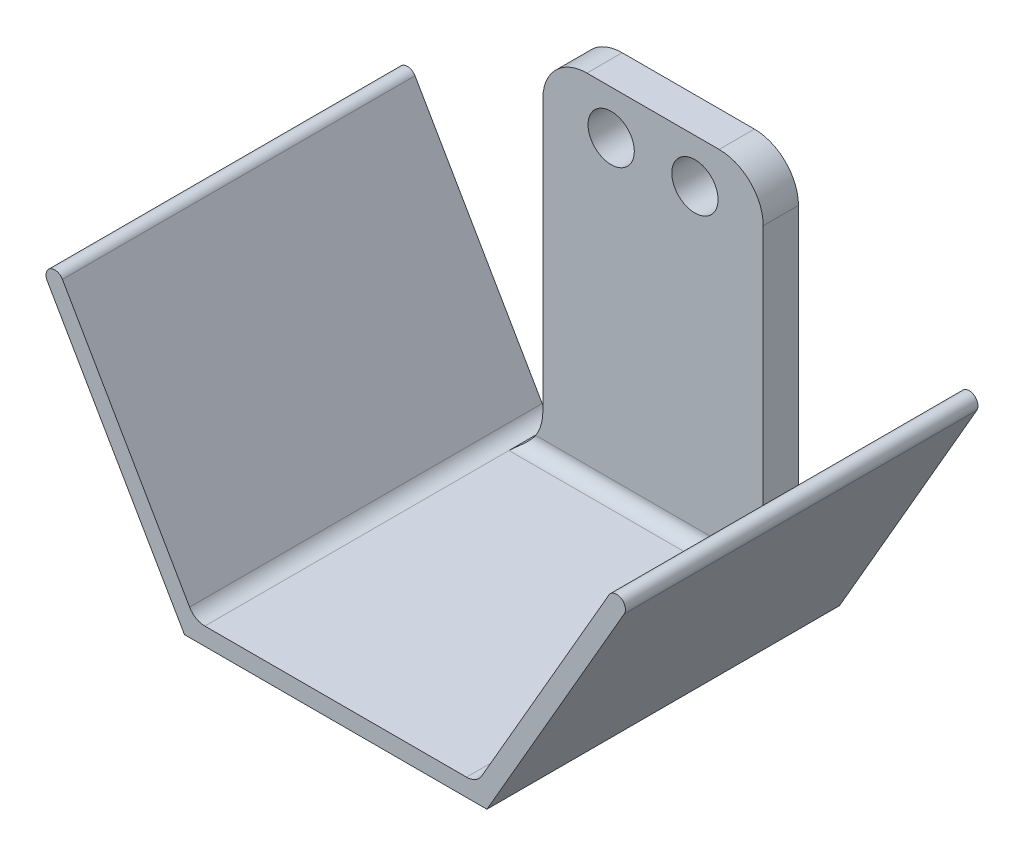
ISO-10303-21;
HEADER;
FILE_DESCRIPTION(('STEP AP214'),'2;1');
FILE_NAME('part.step','',(''),(''),'','','');
FILE_SCHEMA(('AUTOMOTIVE_DESIGN { 1 0 10303 214 1 1 1 1 }'));
ENDSEC;
DATA;
#1=APPLICATION_CONTEXT('core data for automotive mechanical design processes');
#2=APPLICATION_PROTOCOL_DEFINITION('international standard','automotive_design',2000,#1);
#3=PRODUCT_CONTEXT('',#1,'mechanical');
#4=PRODUCT('Part','Part','',(#3));
#5=PRODUCT_RELATED_PRODUCT_CATEGORY('part','',(#4));
#6=PRODUCT_DEFINITION_FORMATION('','',#4);
#7=PRODUCT_DEFINITION_CONTEXT('part definition',#1,'design');
#8=PRODUCT_DEFINITION('design','',#6,#7);
#9=PRODUCT_DEFINITION_SHAPE('','',#8);
#10=(LENGTH_UNIT() NAMED_UNIT(*) SI_UNIT(.MILLI.,.METRE.));
#11=(NAMED_UNIT(*) PLANE_ANGLE_UNIT() SI_UNIT($,.RADIAN.));
#12=(NAMED_UNIT(*) SI_UNIT($,.STERADIAN.) SOLID_ANGLE_UNIT());
#13=UNCERTAINTY_MEASURE_WITH_UNIT(LENGTH_MEASURE(1.E-05),#10,'distance_accuracy_value','');
#14=(GEOMETRIC_REPRESENTATION_CONTEXT(3) GLOBAL_UNCERTAINTY_ASSIGNED_CONTEXT((#13)) GLOBAL_UNIT_ASSIGNED_CONTEXT((#10,
#11,#12)) REPRESENTATION_CONTEXT('',''));
#15=CARTESIAN_POINT('',(0.,0.,0.));
#16=DIRECTION('',(0.,0.,1.));
#17=DIRECTION('',(1.,0.,0.));
#18=AXIS2_PLACEMENT_3D('',#15,#16,#17);
#19=CARTESIAN_POINT('',(-32.,0.,40.));
#20=DIRECTION('',(0.,-1.,0.));
#21=DIRECTION('',(1.,0.,0.));
#22=AXIS2_PLACEMENT_3D('',#19,#20,#21);
#23=PLANE('',#22);
#24=DIRECTION('',(0.,0.,-1.));
#25=VECTOR('',#24,1.);
#26=CARTESIAN_POINT('',(29.6905989232415,0.,-40.));
#27=LINE('',#26,#25);
#28=CARTESIAN_POINT('',(29.6905989232415,0.,40.));
#29=VERTEX_POINT('',#28);
#30=CARTESIAN_POINT('',(29.6905989232415,0.,-29.));
#31=VERTEX_POINT('',#30);
#32=EDGE_CURVE('E214',#29,#31,#27,.T.);
#33=ORIENTED_EDGE('',*,*,#32,.T.);
#34=DIRECTION('',(1.,0.,0.));
#35=VECTOR('',#34,1.);
#36=CARTESIAN_POINT('',(-29.6905989232415,0.,-29.));
#37=LINE('',#36,#35);
#38=CARTESIAN_POINT('',(-29.6905989232415,0.,-29.));
#39=VERTEX_POINT('',#38);
#40=EDGE_CURVE('E288',#31,#39,#37,.F.);
#41=ORIENTED_EDGE('',*,*,#40,.T.);
#42=DIRECTION('',(0.,0.,-1.));
#43=VECTOR('',#42,1.);
#44=CARTESIAN_POINT('',(-29.6905989232415,0.,40.));
#45=LINE('',#44,#43);
#46=CARTESIAN_POINT('',(-29.6905989232415,0.,40.));
#47=VERTEX_POINT('',#46);
#48=EDGE_CURVE('E204',#39,#47,#45,.F.);
#49=ORIENTED_EDGE('',*,*,#48,.T.);
#50=DIRECTION('',(-1.,0.,0.));
#51=VECTOR('',#50,1.);
#52=CARTESIAN_POINT('',(-32.,0.,40.));
#53=LINE('',#52,#51);
#54=EDGE_CURVE('E355',#29,#47,#53,.T.);
#55=ORIENTED_EDGE('',*,*,#54,.F.);
#56=EDGE_LOOP('',(#33,#41,#49,#55));
#57=FACE_BOUND('',#56,.T.);
#58=ADVANCED_FACE('F43',(#57),#23,.F.);
#59=CARTESIAN_POINT('',(-34.3094010767585,-4.,40.));
#60=DIRECTION('',(0.,1.,0.));
#61=DIRECTION('',(0.,0.,1.));
#62=AXIS2_PLACEMENT_3D('',#59,#60,#61);
#63=PLANE('',#62);
#64=DIRECTION('',(1.,0.,0.));
#65=VECTOR('',#64,1.);
#66=CARTESIAN_POINT('',(-34.3094010767585,-4.,-40.));
#67=LINE('',#66,#65);
#68=CARTESIAN_POINT('',(-34.3094010767585,-4.,-40.));
#69=VERTEX_POINT('',#68);
#70=CARTESIAN_POINT('',(34.3094010767585,-4.,-40.));
#71=VERTEX_POINT('',#70);
#72=EDGE_CURVE('E202',#69,#71,#67,.T.);
#73=ORIENTED_EDGE('',*,*,#72,.T.);
#74=DIRECTION('',(0.,0.,-1.));
#75=VECTOR('',#74,1.);
#76=CARTESIAN_POINT('',(34.3094010767585,-4.,40.));
#77=LINE('',#76,#75);
#78=CARTESIAN_POINT('',(34.3094010767585,-4.,40.));
#79=VERTEX_POINT('',#78);
#80=EDGE_CURVE('E180',#79,#71,#77,.T.);
#81=ORIENTED_EDGE('',*,*,#80,.F.);
#82=DIRECTION('',(1.,0.,0.));
#83=VECTOR('',#82,1.);
#84=CARTESIAN_POINT('',(-34.3094010767585,-4.,40.));
#85=LINE('',#84,#83);
#86=CARTESIAN_POINT('',(-34.3094010767585,-4.,40.));
#87=VERTEX_POINT('',#86);
#88=EDGE_CURVE('E188',#87,#79,#85,.T.);
#89=ORIENTED_EDGE('',*,*,#88,.F.);
#90=DIRECTION('',(0.,0.,-1.));
#91=VECTOR('',#90,1.);
#92=CARTESIAN_POINT('',(-34.3094010767585,-4.,40.));
#93=LINE('',#92,#91);
#94=EDGE_CURVE('E375',#87,#69,#93,.T.);
#95=ORIENTED_EDGE('',*,*,#94,.T.);
#96=EDGE_LOOP('',(#73,#81,#89,#95));
#97=FACE_BOUND('',#96,.T.);
#98=ADVANCED_FACE('F200',(#97),#63,.F.);
#99=CARTESIAN_POINT('',(34.3094010767585,-4.,40.));
#100=DIRECTION('',(-0.86602540378444,0.499999999999998,0.));
#101=DIRECTION('',(-0.499999999999998,-0.86602540378444,0.));
#102=AXIS2_PLACEMENT_3D('',#99,#100,#101);
#103=PLANE('',#102);
#104=DIRECTION('',(0.499999999999998,0.86602540378444,0.));
#105=VECTOR('',#104,1.);
#106=CARTESIAN_POINT('',(34.3094010767585,-4.,-40.));
#107=LINE('',#106,#105);
#108=CARTESIAN_POINT('',(65.4641016151376,49.9615242270664,-40.));
#109=VERTEX_POINT('',#108);
#110=EDGE_CURVE('E378',#71,#109,#107,.T.);
#111=ORIENTED_EDGE('',*,*,#110,.T.);
#112=DIRECTION('',(0.,0.,-1.));
#113=VECTOR('',#112,1.);
#114=CARTESIAN_POINT('',(65.4641016151376,49.9615242270664,40.));
#115=LINE('',#114,#113);
#116=CARTESIAN_POINT('',(65.4641016151376,49.9615242270664,40.));
#117=VERTEX_POINT('',#116);
#118=EDGE_CURVE('E183',#117,#109,#115,.T.);
#119=ORIENTED_EDGE('',*,*,#118,.F.);
#120=DIRECTION('',(0.499999999999998,0.86602540378444,0.));
#121=VECTOR('',#120,1.);
#122=CARTESIAN_POINT('',(34.3094010767585,-4.,40.));
#123=LINE('',#122,#121);
#124=EDGE_CURVE('E176',#79,#117,#123,.T.);
#125=ORIENTED_EDGE('',*,*,#124,.F.);
#126=ORIENTED_EDGE('',*,*,#80,.T.);
#127=EDGE_LOOP('',(#111,#119,#125,#126));
#128=FACE_BOUND('',#127,.T.);
#129=ADVANCED_FACE('F178',(#128),#103,.F.);
#130=CARTESIAN_POINT('',(63.7320508075687,50.9615242270664,40.));
#131=DIRECTION('',(0.,0.,-1.));
#132=DIRECTION('',(-1.,0.,0.));
#133=AXIS2_PLACEMENT_3D('',#130,#131,#132);
#134=CYLINDRICAL_SURFACE('',#133,2.);
#135=CARTESIAN_POINT('',(63.7320508075687,50.9615242270664,-40.));
#136=DIRECTION('',(0.,0.,1.));
#137=DIRECTION('',(-1.,0.,0.));
#138=AXIS2_PLACEMENT_3D('',#135,#136,#137);
#139=CIRCLE('',#138,2.);
#140=CARTESIAN_POINT('',(61.9999999999999,51.9615242270664,-40.));
#141=VERTEX_POINT('',#140);
#142=EDGE_CURVE('E382',#109,#141,#139,.T.);
#143=ORIENTED_EDGE('',*,*,#142,.T.);
#144=DIRECTION('',(0.,0.,-1.));
#145=VECTOR('',#144,1.);
#146=CARTESIAN_POINT('',(61.9999999999999,51.9615242270664,40.));
#147=LINE('',#146,#145);
#148=CARTESIAN_POINT('',(61.9999999999999,51.9615242270664,40.));
#149=VERTEX_POINT('',#148);
#150=EDGE_CURVE('E209',#149,#141,#147,.T.);
#151=ORIENTED_EDGE('',*,*,#150,.F.);
#152=CARTESIAN_POINT('',(63.7320508075687,50.9615242270664,40.));
#153=DIRECTION('',(0.,0.,1.));
#154=DIRECTION('',(-1.,0.,0.));
#155=AXIS2_PLACEMENT_3D('',#152,#153,#154);
#156=CIRCLE('',#155,2.);
#157=EDGE_CURVE('E187',#117,#149,#156,.T.);
#158=ORIENTED_EDGE('',*,*,#157,.F.);
#159=ORIENTED_EDGE('',*,*,#118,.T.);
#160=EDGE_LOOP('',(#143,#151,#158,#159));
#161=FACE_BOUND('',#160,.T.);
#162=ADVANCED_FACE('F333',(#161),#134,.T.);
#163=CARTESIAN_POINT('',(32.,0.,40.));
#164=DIRECTION('',(0.86602540378444,-0.499999999999998,0.));
#165=DIRECTION('',(0.499999999999998,0.86602540378444,0.));
#166=AXIS2_PLACEMENT_3D('',#163,#164,#165);
#167=PLANE('',#166);
#168=DIRECTION('',(-0.499999999999998,-0.86602540378444,0.));
#169=VECTOR('',#168,1.);
#170=CARTESIAN_POINT('',(32.,0.,-40.));
#171=LINE('',#170,#169);
#172=CARTESIAN_POINT('',(33.1547005383793,2.00000000000002,-40.));
#173=VERTEX_POINT('',#172);
#174=EDGE_CURVE('E385',#141,#173,#171,.T.);
#175=ORIENTED_EDGE('',*,*,#174,.T.);
#176=DIRECTION('',(0.,0.,-1.));
#177=VECTOR('',#176,1.);
#178=CARTESIAN_POINT('',(33.1547005383793,2.00000000000002,40.));
#179=LINE('',#178,#177);
#180=CARTESIAN_POINT('',(33.1547005383793,2.00000000000002,40.));
#181=VERTEX_POINT('',#180);
#182=EDGE_CURVE('E218',#173,#181,#179,.F.);
#183=ORIENTED_EDGE('',*,*,#182,.T.);
#184=DIRECTION('',(-0.499999999999998,-0.86602540378444,0.));
#185=VECTOR('',#184,1.);
#186=CARTESIAN_POINT('',(32.,0.,40.));
#187=LINE('',#186,#185);
#188=EDGE_CURVE('E358',#149,#181,#187,.T.);
#189=ORIENTED_EDGE('',*,*,#188,.F.);
#190=ORIENTED_EDGE('',*,*,#150,.T.);
#191=EDGE_LOOP('',(#175,#183,#189,#190));
#192=FACE_BOUND('',#191,.T.);
#193=ADVANCED_FACE('F330',(#192),#167,.F.);
#194=CARTESIAN_POINT('',(-32.,0.,40.));
#195=DIRECTION('',(-0.866025403784436,-0.500000000000004,0.));
#196=DIRECTION('',(0.500000000000004,-0.866025403784436,0.));
#197=AXIS2_PLACEMENT_3D('',#194,#195,#196);
#198=PLANE('',#197);
#199=DIRECTION('',(-0.500000000000004,0.866025403784436,0.));
#200=VECTOR('',#199,1.);
#201=CARTESIAN_POINT('',(-32.,0.,40.));
#202=LINE('',#201,#200);
#203=CARTESIAN_POINT('',(-33.1547005383793,1.99999999999998,40.));
#204=VERTEX_POINT('',#203);
#205=CARTESIAN_POINT('',(-62.0000000000002,51.9615242270662,40.));
#206=VERTEX_POINT('',#205);
#207=EDGE_CURVE('E362',#204,#206,#202,.T.);
#208=ORIENTED_EDGE('',*,*,#207,.F.);
#209=DIRECTION('',(0.,0.,-1.));
#210=VECTOR('',#209,1.);
#211=CARTESIAN_POINT('',(-33.1547005383793,1.99999999999998,-40.));
#212=LINE('',#211,#210);
#213=CARTESIAN_POINT('',(-33.1547005383793,1.99999999999998,-40.));
#214=VERTEX_POINT('',#213);
#215=EDGE_CURVE('E221',#204,#214,#212,.T.);
#216=ORIENTED_EDGE('',*,*,#215,.T.);
#217=DIRECTION('',(-0.500000000000004,0.866025403784436,0.));
#218=VECTOR('',#217,1.);
#219=CARTESIAN_POINT('',(-32.,0.,-40.));
#220=LINE('',#219,#218);
#221=CARTESIAN_POINT('',(-62.0000000000002,51.9615242270662,-40.));
#222=VERTEX_POINT('',#221);
#223=EDGE_CURVE('E389',#214,#222,#220,.T.);
#224=ORIENTED_EDGE('',*,*,#223,.T.);
#225=DIRECTION('',(0.,0.,-1.));
#226=VECTOR('',#225,1.);
#227=CARTESIAN_POINT('',(-62.0000000000002,51.9615242270662,40.));
#228=LINE('',#227,#226);
#229=EDGE_CURVE('E403',#206,#222,#228,.T.);
#230=ORIENTED_EDGE('',*,*,#229,.F.);
#231=EDGE_LOOP('',(#208,#216,#224,#230));
#232=FACE_BOUND('',#231,.T.);
#233=ADVANCED_FACE('F328',(#232),#198,.F.);
#234=CARTESIAN_POINT('',(-63.7320508075691,50.9615242270661,40.));
#235=DIRECTION('',(0.,0.,-1.));
#236=DIRECTION('',(-1.,0.,0.));
#237=AXIS2_PLACEMENT_3D('',#234,#235,#236);
#238=CYLINDRICAL_SURFACE('',#237,2.);
#239=CARTESIAN_POINT('',(-63.7320508075691,50.9615242270661,-40.));
#240=DIRECTION('',(0.,0.,1.));
#241=DIRECTION('',(1.,0.,0.));
#242=AXIS2_PLACEMENT_3D('',#239,#240,#241);
#243=CIRCLE('',#242,2.);
#244=CARTESIAN_POINT('',(-65.464101615138,49.9615242270661,-40.));
#245=VERTEX_POINT('',#244);
#246=EDGE_CURVE('E392',#222,#245,#243,.T.);
#247=ORIENTED_EDGE('',*,*,#246,.T.);
#248=DIRECTION('',(0.,0.,-1.));
#249=VECTOR('',#248,1.);
#250=CARTESIAN_POINT('',(-65.464101615138,49.9615242270661,40.));
#251=LINE('',#250,#249);
#252=CARTESIAN_POINT('',(-65.464101615138,49.9615242270661,40.));
#253=VERTEX_POINT('',#252);
#254=EDGE_CURVE('E399',#253,#245,#251,.T.);
#255=ORIENTED_EDGE('',*,*,#254,.F.);
#256=CARTESIAN_POINT('',(-63.7320508075691,50.9615242270661,40.));
#257=DIRECTION('',(0.,0.,1.));
#258=DIRECTION('',(1.,0.,0.));
#259=AXIS2_PLACEMENT_3D('',#256,#257,#258);
#260=CIRCLE('',#259,2.);
#261=EDGE_CURVE('E366',#206,#253,#260,.T.);
#262=ORIENTED_EDGE('',*,*,#261,.F.);
#263=ORIENTED_EDGE('',*,*,#229,.T.);
#264=EDGE_LOOP('',(#247,#255,#262,#263));
#265=FACE_BOUND('',#264,.T.);
#266=ADVANCED_FACE('F506',(#265),#238,.T.);
#267=CARTESIAN_POINT('',(-34.3094010767585,-4.,40.));
#268=DIRECTION('',(0.866025403784436,0.500000000000004,0.));
#269=DIRECTION('',(-0.500000000000004,0.866025403784436,0.));
#270=AXIS2_PLACEMENT_3D('',#267,#268,#269);
#271=PLANE('',#270);
#272=DIRECTION('',(0.500000000000004,-0.866025403784436,0.));
#273=VECTOR('',#272,1.);
#274=CARTESIAN_POINT('',(-34.3094010767585,-4.,-40.));
#275=LINE('',#274,#273);
#276=EDGE_CURVE('E198',#245,#69,#275,.T.);
#277=ORIENTED_EDGE('',*,*,#276,.T.);
#278=ORIENTED_EDGE('',*,*,#94,.F.);
#279=DIRECTION('',(0.500000000000004,-0.866025403784436,0.));
#280=VECTOR('',#279,1.);
#281=CARTESIAN_POINT('',(-34.3094010767585,-4.,40.));
#282=LINE('',#281,#280);
#283=EDGE_CURVE('E193',#253,#87,#282,.T.);
#284=ORIENTED_EDGE('',*,*,#283,.F.);
#285=ORIENTED_EDGE('',*,*,#254,.T.);
#286=EDGE_LOOP('',(#277,#278,#284,#285));
#287=FACE_BOUND('',#286,.T.);
#288=ADVANCED_FACE('F503',(#287),#271,.F.);
#289=CARTESIAN_POINT('',(63.7320508075687,50.9615242270664,40.));
#290=DIRECTION('',(0.,0.,-1.));
#291=DIRECTION('',(-1.,0.,0.));
#292=AXIS2_PLACEMENT_3D('',#289,#290,#291);
#293=PLANE('',#292);
#294=ORIENTED_EDGE('',*,*,#88,.T.);
#295=ORIENTED_EDGE('',*,*,#124,.T.);
#296=ORIENTED_EDGE('',*,*,#157,.T.);
#297=ORIENTED_EDGE('',*,*,#188,.T.);
#298=CARTESIAN_POINT('',(29.6905989232415,4.00000000000001,40.));
#299=DIRECTION('',(0.,0.,-1.));
#300=DIRECTION('',(-1.,0.,0.));
#301=AXIS2_PLACEMENT_3D('',#298,#299,#300);
#302=CIRCLE('',#301,4.);
#303=EDGE_CURVE('E228',#181,#29,#302,.T.);
#304=ORIENTED_EDGE('',*,*,#303,.T.);
#305=ORIENTED_EDGE('',*,*,#54,.T.);
#306=CARTESIAN_POINT('',(-29.6905989232415,4.,40.));
#307=DIRECTION('',(0.,0.,-1.));
#308=DIRECTION('',(-1.,0.,0.));
#309=AXIS2_PLACEMENT_3D('',#306,#307,#308);
#310=CIRCLE('',#309,4.);
#311=EDGE_CURVE('E234',#47,#204,#310,.T.);
#312=ORIENTED_EDGE('',*,*,#311,.T.);
#313=ORIENTED_EDGE('',*,*,#207,.T.);
#314=ORIENTED_EDGE('',*,*,#261,.T.);
#315=ORIENTED_EDGE('',*,*,#283,.T.);
#316=EDGE_LOOP('',(#294,#295,#296,#297,#304,#305,#312,#313,#314,#315));
#317=FACE_BOUND('',#316,.T.);
#318=ADVANCED_FACE('F191',(#317),#293,.F.);
#319=CARTESIAN_POINT('',(63.7320508075687,50.9615242270664,-40.));
#320=DIRECTION('',(0.,0.,-1.));
#321=DIRECTION('',(-1.,0.,0.));
#322=AXIS2_PLACEMENT_3D('',#319,#320,#321);
#323=PLANE('',#322);
#324=CARTESIAN_POINT('',(-9.50000000000001,70.,-40.));
#325=DIRECTION('',(0.,0.,1.));
#326=DIRECTION('',(1.,0.,0.));
#327=AXIS2_PLACEMENT_3D('',#324,#325,#326);
#328=CIRCLE('',#327,5.25);
#329=CARTESIAN_POINT('',(-4.25000000000001,70.,-40.));
#330=VERTEX_POINT('',#329);
#331=EDGE_CURVE('E461',#330,#330,#328,.T.);
#332=ORIENTED_EDGE('',*,*,#331,.T.);
#333=EDGE_LOOP('',(#332));
#334=FACE_BOUND('',#333,.T.);
#335=CARTESIAN_POINT('',(9.49999999999999,70.,-40.));
#336=DIRECTION('',(0.,0.,1.));
#337=DIRECTION('',(1.,0.,0.));
#338=AXIS2_PLACEMENT_3D('',#335,#336,#337);
#339=CIRCLE('',#338,5.25);
#340=CARTESIAN_POINT('',(14.75,70.,-40.));
#341=VERTEX_POINT('',#340);
#342=EDGE_CURVE('E467',#341,#341,#339,.T.);
#343=ORIENTED_EDGE('',*,*,#342,.T.);
#344=EDGE_LOOP('',(#343));
#345=FACE_BOUND('',#344,.T.);
#346=DIRECTION('',(-1.,0.,0.));
#347=VECTOR('',#346,1.);
#348=CARTESIAN_POINT('',(-25.,80.,-40.));
#349=LINE('',#348,#347);
#350=CARTESIAN_POINT('',(15.,80.,-40.));
#351=VERTEX_POINT('',#350);
#352=CARTESIAN_POINT('',(-15.,80.,-40.));
#353=VERTEX_POINT('',#352);
#354=EDGE_CURVE('E434',#351,#353,#349,.T.);
#355=ORIENTED_EDGE('',*,*,#354,.F.);
#356=CARTESIAN_POINT('',(15.,70.,-40.));
#357=DIRECTION('',(0.,0.,-1.));
#358=DIRECTION('',(-1.,0.,0.));
#359=AXIS2_PLACEMENT_3D('',#356,#357,#358);
#360=CIRCLE('',#359,10.);
#361=CARTESIAN_POINT('',(25.,70.,-40.));
#362=VERTEX_POINT('',#361);
#363=EDGE_CURVE('E255',#351,#362,#360,.T.);
#364=ORIENTED_EDGE('',*,*,#363,.T.);
#365=DIRECTION('',(0.,-1.,0.));
#366=VECTOR('',#365,1.);
#367=CARTESIAN_POINT('',(25.,80.,-40.));
#368=LINE('',#367,#366);
#369=CARTESIAN_POINT('',(25.,8.47409347400156,-40.));
#370=VERTEX_POINT('',#369);
#371=EDGE_CURVE('E433',#362,#370,#368,.T.);
#372=ORIENTED_EDGE('',*,*,#371,.T.);
#373=CARTESIAN_POINT('',(35.,8.47409347400156,-40.));
#374=DIRECTION('',(0.,0.,-1.));
#375=DIRECTION('',(-1.,0.,0.));
#376=AXIS2_PLACEMENT_3D('',#373,#374,#375);
#377=CIRCLE('',#376,10.);
#378=CARTESIAN_POINT('',(29.6905989232415,0.,-40.));
#379=VERTEX_POINT('',#378);
#380=EDGE_CURVE('E271',#370,#379,#377,.F.);
#381=ORIENTED_EDGE('',*,*,#380,.T.);
#382=CARTESIAN_POINT('',(29.6905989232415,4.00000000000001,-40.));
#383=DIRECTION('',(0.,0.,-1.));
#384=DIRECTION('',(-1.,0.,0.));
#385=AXIS2_PLACEMENT_3D('',#382,#383,#384);
#386=CIRCLE('',#385,4.);
#387=EDGE_CURVE('E225',#379,#173,#386,.F.);
#388=ORIENTED_EDGE('',*,*,#387,.T.);
#389=ORIENTED_EDGE('',*,*,#174,.F.);
#390=ORIENTED_EDGE('',*,*,#142,.F.);
#391=ORIENTED_EDGE('',*,*,#110,.F.);
#392=ORIENTED_EDGE('',*,*,#72,.F.);
#393=ORIENTED_EDGE('',*,*,#276,.F.);
#394=ORIENTED_EDGE('',*,*,#246,.F.);
#395=ORIENTED_EDGE('',*,*,#223,.F.);
#396=CARTESIAN_POINT('',(-29.6905989232415,4.,-40.));
#397=DIRECTION('',(0.,0.,-1.));
#398=DIRECTION('',(-1.,0.,0.));
#399=AXIS2_PLACEMENT_3D('',#396,#397,#398);
#400=CIRCLE('',#399,4.);
#401=CARTESIAN_POINT('',(-29.6905989232415,0.,-40.));
#402=VERTEX_POINT('',#401);
#403=EDGE_CURVE('E231',#214,#402,#400,.F.);
#404=ORIENTED_EDGE('',*,*,#403,.T.);
#405=CARTESIAN_POINT('',(-35.,8.47409347400156,-40.));
#406=DIRECTION('',(0.,0.,-1.));
#407=DIRECTION('',(-1.,0.,0.));
#408=AXIS2_PLACEMENT_3D('',#405,#406,#407);
#409=CIRCLE('',#408,10.);
#410=CARTESIAN_POINT('',(-25.,8.47409347400156,-40.));
#411=VERTEX_POINT('',#410);
#412=EDGE_CURVE('E281',#402,#411,#409,.F.);
#413=ORIENTED_EDGE('',*,*,#412,.T.);
#414=DIRECTION('',(0.,-1.,0.));
#415=VECTOR('',#414,1.);
#416=CARTESIAN_POINT('',(-25.,80.,-40.));
#417=LINE('',#416,#415);
#418=CARTESIAN_POINT('',(-25.,70.,-40.));
#419=VERTEX_POINT('',#418);
#420=EDGE_CURVE('E430',#419,#411,#417,.T.);
#421=ORIENTED_EDGE('',*,*,#420,.F.);
#422=CARTESIAN_POINT('',(-15.,70.,-40.));
#423=DIRECTION('',(0.,0.,-1.));
#424=DIRECTION('',(-1.,0.,0.));
#425=AXIS2_PLACEMENT_3D('',#422,#423,#424);
#426=CIRCLE('',#425,10.);
#427=EDGE_CURVE('E252',#419,#353,#426,.T.);
#428=ORIENTED_EDGE('',*,*,#427,.T.);
#429=EDGE_LOOP('',(#355,#364,#372,#381,#388,#389,#390,#391,#392,#393,#394,#395,#404,#413,#421,#428));
#430=FACE_BOUND('',#429,.T.);
#431=ADVANCED_FACE('F341',(#334,#345,#430),#323,.T.);
#432=CARTESIAN_POINT('',(29.6905989232415,4.00000000000001,40.));
#433=DIRECTION('',(0.,0.,1.));
#434=DIRECTION('',(1.,0.,0.));
#435=AXIS2_PLACEMENT_3D('',#432,#433,#434);
#436=CYLINDRICAL_SURFACE('',#435,4.);
#437=ORIENTED_EDGE('',*,*,#303,.F.);
#438=ORIENTED_EDGE('',*,*,#182,.F.);
#439=ORIENTED_EDGE('',*,*,#387,.F.);
#440=EDGE_CURVE('E71',#31,#379,#27,.T.);
#441=ORIENTED_EDGE('',*,*,#440,.F.);
#442=ORIENTED_EDGE('',*,*,#32,.F.);
#443=EDGE_LOOP('',(#437,#438,#439,#441,#442));
#444=FACE_BOUND('',#443,.T.);
#445=ADVANCED_FACE('F339',(#444),#436,.F.);
#446=CARTESIAN_POINT('',(-29.6905989232415,4.,40.));
#447=DIRECTION('',(0.,0.,1.));
#448=DIRECTION('',(1.,0.,0.));
#449=AXIS2_PLACEMENT_3D('',#446,#447,#448);
#450=CYLINDRICAL_SURFACE('',#449,4.);
#451=ORIENTED_EDGE('',*,*,#311,.F.);
#452=ORIENTED_EDGE('',*,*,#48,.F.);
#453=EDGE_CURVE('E63',#402,#39,#45,.F.);
#454=ORIENTED_EDGE('',*,*,#453,.F.);
#455=ORIENTED_EDGE('',*,*,#403,.F.);
#456=ORIENTED_EDGE('',*,*,#215,.F.);
#457=EDGE_LOOP('',(#451,#452,#454,#455,#456));
#458=FACE_BOUND('',#457,.T.);
#459=ADVANCED_FACE('F304',(#458),#450,.F.);
#460=CARTESIAN_POINT('',(-25.,80.,-40.));
#461=DIRECTION('',(1.,0.,0.));
#462=DIRECTION('',(0.,1.,0.));
#463=AXIS2_PLACEMENT_3D('',#460,#461,#462);
#464=PLANE('',#463);
#465=DIRECTION('',(0.,-1.,0.));
#466=VECTOR('',#465,1.);
#467=CARTESIAN_POINT('',(-25.,80.,-32.));
#468=LINE('',#467,#466);
#469=CARTESIAN_POINT('',(-25.,70.,-32.));
#470=VERTEX_POINT('',#469);
#471=CARTESIAN_POINT('',(-25.,8.47409347400156,-32.));
#472=VERTEX_POINT('',#471);
#473=EDGE_CURVE('E379',#470,#472,#468,.T.);
#474=ORIENTED_EDGE('',*,*,#473,.F.);
#475=DIRECTION('',(0.,0.,1.));
#476=VECTOR('',#475,1.);
#477=CARTESIAN_POINT('',(-25.,70.,-40.));
#478=LINE('',#477,#476);
#479=EDGE_CURVE('E268',#470,#419,#478,.F.);
#480=ORIENTED_EDGE('',*,*,#479,.T.);
#481=ORIENTED_EDGE('',*,*,#420,.T.);
#482=DIRECTION('',(0.,0.,-1.));
#483=VECTOR('',#482,1.);
#484=CARTESIAN_POINT('',(-25.,8.47409347400156,-40.));
#485=LINE('',#484,#483);
#486=EDGE_CURVE('E264',#411,#472,#485,.F.);
#487=ORIENTED_EDGE('',*,*,#486,.T.);
#488=EDGE_LOOP('',(#474,#480,#481,#487));
#489=FACE_BOUND('',#488,.T.);
#490=ADVANCED_FACE('F346',(#489),#464,.F.);
#491=CARTESIAN_POINT('',(-25.,80.,-32.));
#492=DIRECTION('',(0.,0.,-1.));
#493=DIRECTION('',(-1.,0.,0.));
#494=AXIS2_PLACEMENT_3D('',#491,#492,#493);
#495=PLANE('',#494);
#496=CARTESIAN_POINT('',(-9.50000000000001,70.,-32.));
#497=DIRECTION('',(0.,0.,1.));
#498=DIRECTION('',(1.,0.,0.));
#499=AXIS2_PLACEMENT_3D('',#496,#497,#498);
#500=CIRCLE('',#499,5.25);
#501=CARTESIAN_POINT('',(-4.25000000000001,70.,-32.));
#502=VERTEX_POINT('',#501);
#503=EDGE_CURVE('E464',#502,#502,#500,.T.);
#504=ORIENTED_EDGE('',*,*,#503,.F.);
#505=EDGE_LOOP('',(#504));
#506=FACE_BOUND('',#505,.T.);
#507=CARTESIAN_POINT('',(9.49999999999999,70.,-32.));
#508=DIRECTION('',(0.,0.,1.));
#509=DIRECTION('',(1.,0.,0.));
#510=AXIS2_PLACEMENT_3D('',#507,#508,#509);
#511=CIRCLE('',#510,5.25);
#512=CARTESIAN_POINT('',(14.75,70.,-32.));
#513=VERTEX_POINT('',#512);
#514=EDGE_CURVE('E471',#513,#513,#511,.T.);
#515=ORIENTED_EDGE('',*,*,#514,.F.);
#516=EDGE_LOOP('',(#515));
#517=FACE_BOUND('',#516,.T.);
#518=CARTESIAN_POINT('',(-35.,8.47409347400156,-32.));
#519=DIRECTION('',(0.,0.,-1.));
#520=DIRECTION('',(-1.,0.,0.));
#521=AXIS2_PLACEMENT_3D('',#518,#519,#520);
#522=CIRCLE('',#521,10.);
#523=CARTESIAN_POINT('',(-26.6313501305232,3.,-32.));
#524=VERTEX_POINT('',#523);
#525=EDGE_CURVE('E277',#472,#524,#522,.T.);
#526=ORIENTED_EDGE('',*,*,#525,.T.);
#527=DIRECTION('',(1.,0.,0.));
#528=VECTOR('',#527,1.);
#529=CARTESIAN_POINT('',(29.6905989232415,3.00000000000001,-32.));
#530=LINE('',#529,#528);
#531=CARTESIAN_POINT('',(26.6313501305232,3.00000000000001,-32.));
#532=VERTEX_POINT('',#531);
#533=EDGE_CURVE('E284',#524,#532,#530,.T.);
#534=ORIENTED_EDGE('',*,*,#533,.T.);
#535=CARTESIAN_POINT('',(35.,8.47409347400156,-32.));
#536=DIRECTION('',(0.,0.,-1.));
#537=DIRECTION('',(-1.,0.,0.));
#538=AXIS2_PLACEMENT_3D('',#535,#536,#537);
#539=CIRCLE('',#538,10.);
#540=CARTESIAN_POINT('',(25.,8.47409347400156,-32.));
#541=VERTEX_POINT('',#540);
#542=EDGE_CURVE('E274',#532,#541,#539,.T.);
#543=ORIENTED_EDGE('',*,*,#542,.T.);
#544=DIRECTION('',(0.,-1.,0.));
#545=VECTOR('',#544,1.);
#546=CARTESIAN_POINT('',(25.,80.,-32.));
#547=LINE('',#546,#545);
#548=CARTESIAN_POINT('',(25.,70.,-32.));
#549=VERTEX_POINT('',#548);
#550=EDGE_CURVE('E438',#549,#541,#547,.T.);
#551=ORIENTED_EDGE('',*,*,#550,.F.);
#552=CARTESIAN_POINT('',(15.,70.,-32.));
#553=DIRECTION('',(0.,0.,-1.));
#554=DIRECTION('',(-1.,0.,0.));
#555=AXIS2_PLACEMENT_3D('',#552,#553,#554);
#556=CIRCLE('',#555,10.);
#557=CARTESIAN_POINT('',(15.,80.,-32.));
#558=VERTEX_POINT('',#557);
#559=EDGE_CURVE('E261',#549,#558,#556,.F.);
#560=ORIENTED_EDGE('',*,*,#559,.T.);
#561=DIRECTION('',(1.,0.,0.));
#562=VECTOR('',#561,1.);
#563=CARTESIAN_POINT('',(-25.,80.,-32.));
#564=LINE('',#563,#562);
#565=CARTESIAN_POINT('',(-15.,80.,-32.));
#566=VERTEX_POINT('',#565);
#567=EDGE_CURVE('E441',#566,#558,#564,.T.);
#568=ORIENTED_EDGE('',*,*,#567,.F.);
#569=CARTESIAN_POINT('',(-15.,70.,-32.));
#570=DIRECTION('',(0.,0.,-1.));
#571=DIRECTION('',(-1.,0.,0.));
#572=AXIS2_PLACEMENT_3D('',#569,#570,#571);
#573=CIRCLE('',#572,10.);
#574=EDGE_CURVE('E258',#566,#470,#573,.F.);
#575=ORIENTED_EDGE('',*,*,#574,.T.);
#576=ORIENTED_EDGE('',*,*,#473,.T.);
#577=EDGE_LOOP('',(#526,#534,#543,#551,#560,#568,#575,#576));
#578=FACE_BOUND('',#577,.T.);
#579=ADVANCED_FACE('F420',(#506,#517,#578),#495,.F.);
#580=CARTESIAN_POINT('',(25.,80.,-40.));
#581=DIRECTION('',(-1.,0.,0.));
#582=DIRECTION('',(0.,-1.,0.));
#583=AXIS2_PLACEMENT_3D('',#580,#581,#582);
#584=PLANE('',#583);
#585=ORIENTED_EDGE('',*,*,#550,.T.);
#586=DIRECTION('',(0.,0.,-1.));
#587=VECTOR('',#586,1.);
#588=CARTESIAN_POINT('',(25.,8.47409347400156,-40.));
#589=LINE('',#588,#587);
#590=EDGE_CURVE('E240',#541,#370,#589,.T.);
#591=ORIENTED_EDGE('',*,*,#590,.T.);
#592=ORIENTED_EDGE('',*,*,#371,.F.);
#593=DIRECTION('',(0.,0.,-1.));
#594=VECTOR('',#593,1.);
#595=CARTESIAN_POINT('',(25.,70.,-32.));
#596=LINE('',#595,#594);
#597=EDGE_CURVE('E237',#362,#549,#596,.F.);
#598=ORIENTED_EDGE('',*,*,#597,.T.);
#599=EDGE_LOOP('',(#585,#591,#592,#598));
#600=FACE_BOUND('',#599,.T.);
#601=ADVANCED_FACE('F450',(#600),#584,.F.);
#602=CARTESIAN_POINT('',(0.,80.,0.));
#603=DIRECTION('',(0.,1.,0.));
#604=DIRECTION('',(-1.,0.,0.));
#605=AXIS2_PLACEMENT_3D('',#602,#603,#604);
#606=PLANE('',#605);
#607=ORIENTED_EDGE('',*,*,#567,.T.);
#608=DIRECTION('',(0.,0.,-1.));
#609=VECTOR('',#608,1.);
#610=CARTESIAN_POINT('',(15.,80.,-40.));
#611=LINE('',#610,#609);
#612=EDGE_CURVE('E248',#558,#351,#611,.T.);
#613=ORIENTED_EDGE('',*,*,#612,.T.);
#614=ORIENTED_EDGE('',*,*,#354,.T.);
#615=DIRECTION('',(0.,0.,1.));
#616=VECTOR('',#615,1.);
#617=CARTESIAN_POINT('',(-15.,80.,-32.));
#618=LINE('',#617,#616);
#619=EDGE_CURVE('E244',#353,#566,#618,.T.);
#620=ORIENTED_EDGE('',*,*,#619,.T.);
#621=EDGE_LOOP('',(#607,#613,#614,#620));
#622=FACE_BOUND('',#621,.T.);
#623=ADVANCED_FACE('F458',(#622),#606,.T.);
#624=CARTESIAN_POINT('',(9.49999999999999,70.,-40.));
#625=DIRECTION('',(0.,0.,1.));
#626=DIRECTION('',(1.,0.,0.));
#627=AXIS2_PLACEMENT_3D('',#624,#625,#626);
#628=CYLINDRICAL_SURFACE('',#627,5.25);
#629=ORIENTED_EDGE('',*,*,#342,.F.);
#630=EDGE_LOOP('',(#629));
#631=FACE_BOUND('',#630,.T.);
#632=ORIENTED_EDGE('',*,*,#514,.T.);
#633=EDGE_LOOP('',(#632));
#634=FACE_BOUND('',#633,.T.);
#635=ADVANCED_FACE('F485',(#631,#634),#628,.F.);
#636=CARTESIAN_POINT('',(-9.50000000000001,70.,-40.));
#637=DIRECTION('',(0.,0.,1.));
#638=DIRECTION('',(1.,0.,0.));
#639=AXIS2_PLACEMENT_3D('',#636,#637,#638);
#640=CYLINDRICAL_SURFACE('',#639,5.25);
#641=ORIENTED_EDGE('',*,*,#331,.F.);
#642=EDGE_LOOP('',(#641));
#643=FACE_BOUND('',#642,.T.);
#644=ORIENTED_EDGE('',*,*,#503,.T.);
#645=EDGE_LOOP('',(#644));
#646=FACE_BOUND('',#645,.T.);
#647=ADVANCED_FACE('F302',(#643,#646),#640,.F.);
#648=CARTESIAN_POINT('',(35.,8.47409347400156,40.));
#649=DIRECTION('',(0.,0.,-1.));
#650=DIRECTION('',(-1.,0.,0.));
#651=AXIS2_PLACEMENT_3D('',#648,#649,#650);
#652=CYLINDRICAL_SURFACE('',#651,10.);
#653=ORIENTED_EDGE('',*,*,#542,.F.);
#654=CARTESIAN_POINT('',(26.6313501305232,3.00000000000001,-32.));
#655=CARTESIAN_POINT('',(26.7014560114795,2.89278447930105,-31.9999909309944));
#656=CARTESIAN_POINT('',(26.7736135510567,2.78700686097553,-31.9942546642849));
#657=CARTESIAN_POINT('',(26.9212907613052,2.5791312658608,-31.9721696532764));
#658=CARTESIAN_POINT('',(26.9968065577025,2.47702928281045,-31.9558328569394));
#659=CARTESIAN_POINT('',(27.1502854099251,2.27749919105883,-31.9134772276538));
#660=CARTESIAN_POINT('',(27.2282363966561,2.18005268965377,-31.8875008035057));
#661=CARTESIAN_POINT('',(27.3862450859462,1.98980025239655,-31.8265662027262));
#662=CARTESIAN_POINT('',(27.4663033717463,1.89699562234051,-31.7916055155362));
#663=CARTESIAN_POINT('',(27.7040559129148,1.63125909662731,-31.6764012685987));
#664=CARTESIAN_POINT('',(27.8639234889938,1.46509387194277,-31.584501313222));
#665=CARTESIAN_POINT('',(28.1041007276051,1.23122095077042,-31.4249427319074));
#666=CARTESIAN_POINT('',(28.1843251225669,1.15573928887074,-31.3680518635048));
#667=CARTESIAN_POINT('',(28.3441705615342,1.0100739837358,-31.2470334164515));
#668=CARTESIAN_POINT('',(28.4237916902833,0.939889583472321,-31.1829068751267));
#669=CARTESIAN_POINT('',(28.5672893419092,0.817235166000873,-31.0595341463094));
#670=CARTESIAN_POINT('',(28.6314200992129,0.763850575366001,-31.00148729379));
#671=CARTESIAN_POINT('',(28.757996660955,0.661025180898001,-30.8802955641113));
#672=CARTESIAN_POINT('',(28.8204427896903,0.61158361438202,-30.817151677628));
#673=CARTESIAN_POINT('',(28.942722595688,0.516999083023756,-30.6856034493402));
#674=CARTESIAN_POINT('',(29.0025608641614,0.471848383541994,-30.6172089906825));
#675=CARTESIAN_POINT('',(29.1186078075952,0.386174914551651,-30.4747282021289));
#676=CARTESIAN_POINT('',(29.174818409304,0.345649679399616,-30.4006449402637));
#677=CARTESIAN_POINT('',(29.2936425366281,0.261674492331311,-30.2298283779238));
#678=CARTESIAN_POINT('',(29.3550604766597,0.219447674990732,-30.1316363822875));
#679=CARTESIAN_POINT('',(29.4665870176909,0.144275602282542,-29.9256396837048));
#680=CARTESIAN_POINT('',(29.5167094634775,0.111318972090899,-29.8178469769821));
#681=CARTESIAN_POINT('',(29.5919987457085,0.062486996926565,-29.6160336319291));
#682=CARTESIAN_POINT('',(29.6201666352762,0.0445018105155028,-29.5236629482283));
#683=CARTESIAN_POINT('',(29.6631574786268,0.0172154710693881,-29.3347068742195));
#684=CARTESIAN_POINT('',(29.6780198247587,0.00788868096373483,-29.2381348186802));
#685=CARTESIAN_POINT('',(29.6870765558242,0.00220800530629572,-29.1174810367687));
#686=CARTESIAN_POINT('',(29.6883960789642,0.0013806273952763,-29.0940097015973));
#687=CARTESIAN_POINT('',(29.6901561708518,0.000277244868448554,-29.0470283108236));
#688=CARTESIAN_POINT('',(29.6905970072787,1.07233572923412E-06,-29.0235182691978));
#689=CARTESIAN_POINT('',(29.6905989232407,0.,-28.9999999999999));
#690=B_SPLINE_CURVE_WITH_KNOTS('',3,(#654,#655,#656,#657,#658,#659,#660,#661,#662,#663,#664,
#665,#666,#667,#668,#669,#670,#671,#672,#673,#674,#675,#676,#677,#678,#679,#680,#681,#682,#683,
#684,#685,#686,#687,#688,#689),.UNSPECIFIED.,.F.,.F.,(4,2,2,2,2,2,2,2,2,2,2,2,2,2,2,2,2,4),(0.,
0.38403437109789,0.767636643359601,1.14957091701746,1.53161203449009,2.27311217700444,
2.64481262347045,3.01645984949189,3.32120855948566,3.62589817950429,3.93002771818206,
4.23399437328574,4.60286488893752,4.97128079403366,5.26486339408579,5.55757391221319,
5.6281281096928,5.69866081055292),.UNSPECIFIED.);
#691=EDGE_CURVE('E57',#532,#31,#690,.T.);
#692=ORIENTED_EDGE('',*,*,#691,.T.);
#693=ORIENTED_EDGE('',*,*,#440,.T.);
#694=ORIENTED_EDGE('',*,*,#380,.F.);
#695=ORIENTED_EDGE('',*,*,#590,.F.);
#696=EDGE_LOOP('',(#653,#692,#693,#694,#695));
#697=FACE_BOUND('',#696,.T.);
#698=ADVANCED_FACE('F296',(#697),#652,.F.);
#699=CARTESIAN_POINT('',(15.,70.,0.));
#700=DIRECTION('',(0.,0.,1.));
#701=DIRECTION('',(1.,0.,0.));
#702=AXIS2_PLACEMENT_3D('',#699,#700,#701);
#703=CYLINDRICAL_SURFACE('',#702,10.);
#704=ORIENTED_EDGE('',*,*,#559,.F.);
#705=ORIENTED_EDGE('',*,*,#597,.F.);
#706=ORIENTED_EDGE('',*,*,#363,.F.);
#707=ORIENTED_EDGE('',*,*,#612,.F.);
#708=EDGE_LOOP('',(#704,#705,#706,#707));
#709=FACE_BOUND('',#708,.T.);
#710=ADVANCED_FACE('F301',(#709),#703,.T.);
#711=CARTESIAN_POINT('',(-15.,70.,0.));
#712=DIRECTION('',(0.,0.,-1.));
#713=DIRECTION('',(-1.,0.,0.));
#714=AXIS2_PLACEMENT_3D('',#711,#712,#713);
#715=CYLINDRICAL_SURFACE('',#714,10.);
#716=ORIENTED_EDGE('',*,*,#427,.F.);
#717=ORIENTED_EDGE('',*,*,#479,.F.);
#718=ORIENTED_EDGE('',*,*,#574,.F.);
#719=ORIENTED_EDGE('',*,*,#619,.F.);
#720=EDGE_LOOP('',(#716,#717,#718,#719));
#721=FACE_BOUND('',#720,.T.);
#722=ADVANCED_FACE('F308',(#721),#715,.T.);
#723=CARTESIAN_POINT('',(-35.,8.47409347400156,40.));
#724=DIRECTION('',(0.,0.,-1.));
#725=DIRECTION('',(-1.,0.,0.));
#726=AXIS2_PLACEMENT_3D('',#723,#724,#725);
#727=CYLINDRICAL_SURFACE('',#726,10.);
#728=ORIENTED_EDGE('',*,*,#412,.F.);
#729=ORIENTED_EDGE('',*,*,#453,.T.);
#730=CARTESIAN_POINT('',(-29.6905989232415,0.,-29.));
#731=CARTESIAN_POINT('',(-29.6906215760823,-1.05145251565235E-05,-29.0493257988743));
#732=CARTESIAN_POINT('',(-29.6886579773913,0.00121614210974858,-29.0986371387654));
#733=CARTESIAN_POINT('',(-29.6809342387429,0.00606084313173788,-29.1967793770416));
#734=CARTESIAN_POINT('',(-29.6751791516394,0.00967570481543038,-29.2456108271854));
#735=CARTESIAN_POINT('',(-29.6601416619347,0.0191549317425674,-29.3418725270484));
#736=CARTESIAN_POINT('',(-29.6509040296147,0.0249907538407064,-29.3893126508509));
#737=CARTESIAN_POINT('',(-29.6291873849735,0.0387785278446665,-29.4831349762226));
#738=CARTESIAN_POINT('',(-29.6167071175185,0.046731299191956,-29.5295167605589));
#739=CARTESIAN_POINT('',(-29.5666796268943,0.0788052710251443,-29.6936432749189));
#740=CARTESIAN_POINT('',(-29.5207841450502,0.108555800042616,-29.8078222232045));
#741=CARTESIAN_POINT('',(-29.4151433423075,0.178709828268345,-30.0264807466723));
#742=CARTESIAN_POINT('',(-29.3553185725422,0.219174627640484,-30.1308996747187));
#743=CARTESIAN_POINT('',(-29.2388805848188,0.300137770145727,-30.3109243048831));
#744=CARTESIAN_POINT('',(-29.1838236207253,0.339163613848715,-30.3882312173468));
#745=CARTESIAN_POINT('',(-29.0694638851265,0.422153791622089,-30.536867872711));
#746=CARTESIAN_POINT('',(-29.0101585254303,0.466121145578982,-30.6081939135474));
#747=CARTESIAN_POINT('',(-28.8885296922576,0.558553213426705,-30.7453318093958));
#748=CARTESIAN_POINT('',(-28.82620183765,0.607024555061253,-30.811135258059));
#749=CARTESIAN_POINT('',(-28.6995417338486,0.708090827766469,-30.9374452900072));
#750=CARTESIAN_POINT('',(-28.6352089805412,0.7606868010621,-30.9979505262952));
#751=CARTESIAN_POINT('',(-28.4797483304667,0.891200706332353,-31.1366472942441));
#752=CARTESIAN_POINT('',(-28.3880200076111,0.970950858498056,-31.2124521884896));
#753=CARTESIAN_POINT('',(-28.2035797972649,1.13759983303307,-31.3544529214328));
#754=CARTESIAN_POINT('',(-28.1108675636211,1.22450124918856,-31.4206452493418));
#755=CARTESIAN_POINT('',(-27.9258356018273,1.4049447772373,-31.5431603442596));
#756=CARTESIAN_POINT('',(-27.8335154585152,1.49847281690505,-31.5995031940529));
#757=CARTESIAN_POINT('',(-27.6500852610022,1.69201984999589,-31.7020690771911));
#758=CARTESIAN_POINT('',(-27.5589749512054,1.79203744524657,-31.748294281055));
#759=CARTESIAN_POINT('',(-27.395031536349,1.97970539341233,-31.8226361976724));
#760=CARTESIAN_POINT('',(-27.3218506736659,2.06635731086172,-31.8525137228284));
#761=CARTESIAN_POINT('',(-27.1774322320123,2.24348443051999,-31.9045137275559));
#762=CARTESIAN_POINT('',(-27.1061939613923,2.33395824192703,-31.926639001419));
#763=CARTESIAN_POINT('',(-26.9659551198398,2.51862764370671,-31.9626258851998));
#764=CARTESIAN_POINT('',(-26.8969608626765,2.61283231677217,-31.9764658144796));
#765=CARTESIAN_POINT('',(-26.7618478979769,2.80428923910051,-31.9951547969754));
#766=CARTESIAN_POINT('',(-26.6957322661533,2.90154456588246,-31.9999944532937));
#767=CARTESIAN_POINT('',(-26.6313501305232,3.,-32.));
#768=B_SPLINE_CURVE_WITH_KNOTS('',3,(#730,#731,#732,#733,#734,#735,#736,#737,#738,#739,#740,
#741,#742,#743,#744,#745,#746,#747,#748,#749,#750,#751,#752,#753,#754,#755,#756,#757,#758,#759,
#760,#761,#762,#763,#764,#765,#766,#767),.UNSPECIFIED.,.F.,.F.,(4,2,2,2,2,2,2,2,2,2,2,2,2,2,2,2,
2,2,4),(0.,0.147899729114906,0.295602752340604,0.441468355755587,0.587390504020924,
0.964896973406752,1.34461179796771,1.65204917621474,1.95967546974782,2.26776183783728,
2.57592630656658,3.00512074056949,3.43447153673989,3.86293642147313,4.29130929817512,
4.64286639921117,4.99429665114937,5.34664253200939,5.69935607986837),.UNSPECIFIED.);
#769=EDGE_CURVE('E11',#39,#524,#768,.T.);
#770=ORIENTED_EDGE('',*,*,#769,.T.);
#771=ORIENTED_EDGE('',*,*,#525,.F.);
#772=ORIENTED_EDGE('',*,*,#486,.F.);
#773=EDGE_LOOP('',(#728,#729,#770,#771,#772));
#774=FACE_BOUND('',#773,.T.);
#775=ADVANCED_FACE('F311',(#774),#727,.F.);
#776=CARTESIAN_POINT('',(-25.,3.,-29.));
#777=DIRECTION('',(-1.,0.,0.));
#778=DIRECTION('',(0.,-1.,0.));
#779=AXIS2_PLACEMENT_3D('',#776,#777,#778);
#780=CYLINDRICAL_SURFACE('',#779,3.);
#781=ORIENTED_EDGE('',*,*,#769,.F.);
#782=ORIENTED_EDGE('',*,*,#40,.F.);
#783=ORIENTED_EDGE('',*,*,#691,.F.);
#784=ORIENTED_EDGE('',*,*,#533,.F.);
#785=EDGE_LOOP('',(#781,#782,#783,#784));
#786=FACE_BOUND('',#785,.T.);
#787=ADVANCED_FACE('F45',(#786),#780,.F.);
#788=CLOSED_SHELL('',(#58,#98,#129,#162,#193,#233,#266,#288,#318,#431,#445,#459,#490,#579,#601,
#623,#635,#647,#698,#710,#722,#775,#787));
#789=MANIFOLD_SOLID_BREP('B2',#788);
#790=ADVANCED_BREP_SHAPE_REPRESENTATION('',(#18,#789),#14);
#791=SHAPE_DEFINITION_REPRESENTATION(#9,#790);
ENDSEC;
END-ISO-10303-21;
